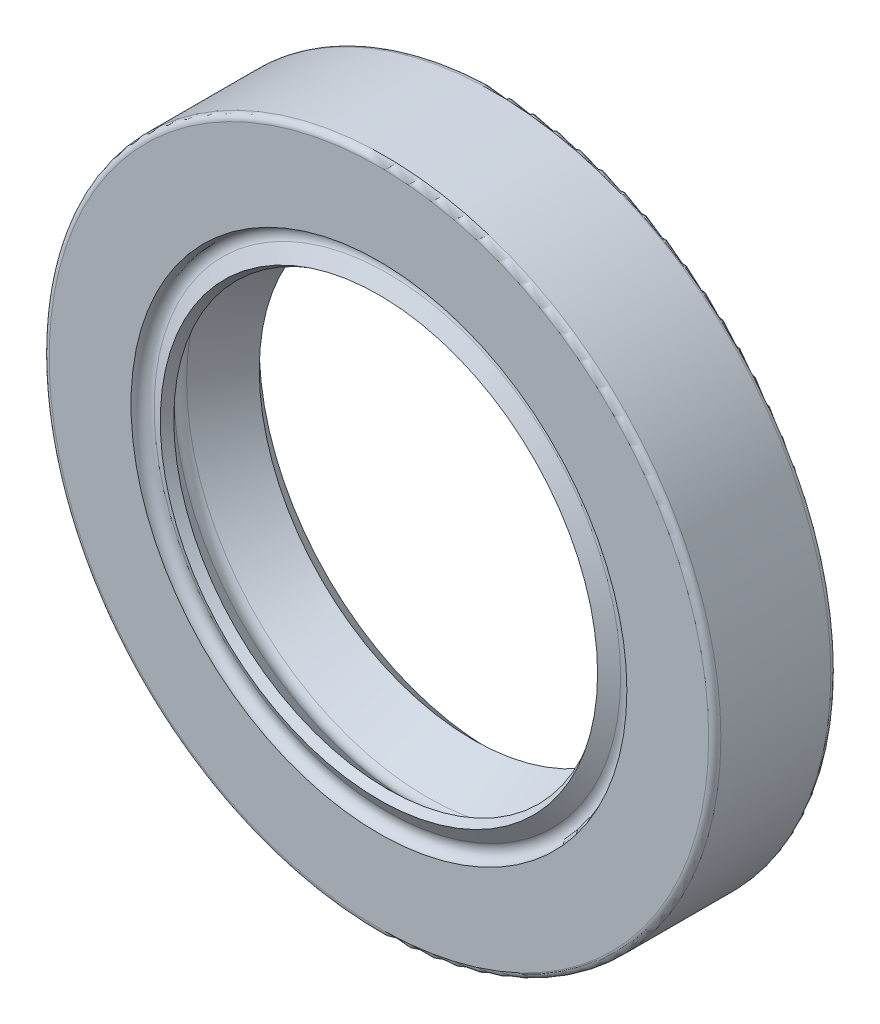
ISO-10303-21;
HEADER;
FILE_DESCRIPTION(('STEP AP214'),'2;1');
FILE_NAME('part.step','',(''),(''),'','','');
FILE_SCHEMA(('AUTOMOTIVE_DESIGN { 1 0 10303 214 1 1 1 1 }'));
ENDSEC;
DATA;
#1=APPLICATION_CONTEXT('core data for automotive mechanical design processes');
#2=APPLICATION_PROTOCOL_DEFINITION('international standard','automotive_design',2000,#1);
#3=PRODUCT_CONTEXT('',#1,'mechanical');
#4=PRODUCT('Part','Part','',(#3));
#5=PRODUCT_RELATED_PRODUCT_CATEGORY('part','',(#4));
#6=PRODUCT_DEFINITION_FORMATION('','',#4);
#7=PRODUCT_DEFINITION_CONTEXT('part definition',#1,'design');
#8=PRODUCT_DEFINITION('design','',#6,#7);
#9=PRODUCT_DEFINITION_SHAPE('','',#8);
#10=(LENGTH_UNIT() NAMED_UNIT(*) SI_UNIT(.MILLI.,.METRE.));
#11=(NAMED_UNIT(*) PLANE_ANGLE_UNIT() SI_UNIT($,.RADIAN.));
#12=(NAMED_UNIT(*) SI_UNIT($,.STERADIAN.) SOLID_ANGLE_UNIT());
#13=UNCERTAINTY_MEASURE_WITH_UNIT(LENGTH_MEASURE(1.E-05),#10,'distance_accuracy_value','');
#14=(GEOMETRIC_REPRESENTATION_CONTEXT(3) GLOBAL_UNCERTAINTY_ASSIGNED_CONTEXT((#13)) GLOBAL_UNIT_ASSIGNED_CONTEXT((#10,
#11,#12)) REPRESENTATION_CONTEXT('',''));
#15=CARTESIAN_POINT('',(0.,0.,0.));
#16=DIRECTION('',(0.,0.,1.));
#17=DIRECTION('',(1.,0.,0.));
#18=AXIS2_PLACEMENT_3D('',#15,#16,#17);
#19=CARTESIAN_POINT('',(0.,0.,-1.3));
#20=DIRECTION('',(0.,0.,1.));
#21=DIRECTION('',(1.,0.,0.));
#22=AXIS2_PLACEMENT_3D('',#19,#20,#21);
#23=TOROIDAL_SURFACE('',#22,9.58987520308393,0.2);
#24=CARTESIAN_POINT('',(0.,0.,-1.1));
#25=DIRECTION('',(0.,0.,1.));
#26=DIRECTION('',(1.,0.,0.));
#27=AXIS2_PLACEMENT_3D('',#24,#25,#26);
#28=CIRCLE('',#27,9.58987520308393);
#29=CARTESIAN_POINT('',(9.58987520308393,0.,-1.1));
#30=VERTEX_POINT('',#29);
#31=EDGE_CURVE('E10',#30,#30,#28,.T.);
#32=ORIENTED_EDGE('',*,*,#31,.T.);
#33=EDGE_LOOP('',(#32));
#34=FACE_BOUND('',#33,.T.);
#35=CARTESIAN_POINT('',(0.,0.,-1.28256885145047));
#36=DIRECTION('',(0.,0.,1.));
#37=DIRECTION('',(1.,0.,0.));
#38=AXIS2_PLACEMENT_3D('',#35,#36,#37);
#39=CIRCLE('',#38,9.78911414270228);
#40=CARTESIAN_POINT('',(9.78911414270228,0.,-1.28256885145047));
#41=VERTEX_POINT('',#40);
#42=EDGE_CURVE('E101',#41,#41,#39,.T.);
#43=ORIENTED_EDGE('',*,*,#42,.F.);
#44=EDGE_LOOP('',(#43));
#45=FACE_BOUND('',#44,.T.);
#46=ADVANCED_FACE('F34',(#34,#45),#23,.F.);
#47=CARTESIAN_POINT('',(9.58987520308393,0.,-1.1));
#48=DIRECTION('',(0.,0.,-1.));
#49=DIRECTION('',(-1.,0.,0.));
#50=AXIS2_PLACEMENT_3D('',#47,#48,#49);
#51=PLANE('',#50);
#52=CARTESIAN_POINT('',(0.,0.,-1.1));
#53=DIRECTION('',(0.,0.,1.));
#54=DIRECTION('',(1.,0.,0.));
#55=AXIS2_PLACEMENT_3D('',#52,#53,#54);
#56=CIRCLE('',#55,8.61010903491329);
#57=CARTESIAN_POINT('',(8.61010903491329,0.,-1.1));
#58=VERTEX_POINT('',#57);
#59=EDGE_CURVE('E40',#58,#58,#56,.T.);
#60=ORIENTED_EDGE('',*,*,#59,.T.);
#61=EDGE_LOOP('',(#60));
#62=FACE_BOUND('',#61,.T.);
#63=ORIENTED_EDGE('',*,*,#31,.F.);
#64=EDGE_LOOP('',(#63));
#65=FACE_BOUND('',#64,.T.);
#66=ADVANCED_FACE('F109',(#62,#65),#51,.T.);
#67=CARTESIAN_POINT('',(0.,0.,-1.3));
#68=DIRECTION('',(0.,0.,1.));
#69=DIRECTION('',(1.,0.,0.));
#70=AXIS2_PLACEMENT_3D('',#67,#68,#69);
#71=TOROIDAL_SURFACE('',#70,8.61010903491329,0.2);
#72=CARTESIAN_POINT('',(0.,0.,-1.28256885145048));
#73=DIRECTION('',(0.,0.,1.));
#74=DIRECTION('',(1.,0.,0.));
#75=AXIS2_PLACEMENT_3D('',#72,#73,#74);
#76=CIRCLE('',#75,8.41087009529494);
#77=CARTESIAN_POINT('',(8.41087009529494,0.,-1.28256885145048));
#78=VERTEX_POINT('',#77);
#79=EDGE_CURVE('E44',#78,#78,#76,.T.);
#80=ORIENTED_EDGE('',*,*,#79,.T.);
#81=EDGE_LOOP('',(#80));
#82=FACE_BOUND('',#81,.T.);
#83=ORIENTED_EDGE('',*,*,#59,.F.);
#84=EDGE_LOOP('',(#83));
#85=FACE_BOUND('',#84,.T.);
#86=ADVANCED_FACE('F113',(#82,#85),#71,.F.);
#87=CARTESIAN_POINT('',(0.,0.,-1.28256885145048));
#88=DIRECTION('',(0.,0.,1.));
#89=DIRECTION('',(1.,0.,0.));
#90=AXIS2_PLACEMENT_3D('',#87,#88,#89);
#91=CONICAL_SURFACE('',#90,8.41087009529494,0.0872664625996557);
#92=CARTESIAN_POINT('',(0.,0.,-2.44546455118659));
#93=DIRECTION('',(0.,0.,1.));
#94=DIRECTION('',(1.,0.,0.));
#95=AXIS2_PLACEMENT_3D('',#92,#93,#94);
#96=CIRCLE('',#95,8.30912990470506);
#97=CARTESIAN_POINT('',(8.30912990470506,0.,-2.44546455118659));
#98=VERTEX_POINT('',#97);
#99=EDGE_CURVE('E48',#98,#98,#96,.T.);
#100=ORIENTED_EDGE('',*,*,#99,.T.);
#101=EDGE_LOOP('',(#100));
#102=FACE_BOUND('',#101,.T.);
#103=ORIENTED_EDGE('',*,*,#79,.F.);
#104=EDGE_LOOP('',(#103));
#105=FACE_BOUND('',#104,.T.);
#106=ADVANCED_FACE('F117',(#102,#105),#91,.T.);
#107=CARTESIAN_POINT('',(0.,0.,-2.88));
#108=DIRECTION('',(0.,0.,1.));
#109=DIRECTION('',(1.,0.,0.));
#110=AXIS2_PLACEMENT_3D('',#107,#108,#109);
#111=TOROIDAL_SURFACE('',#110,8.24,0.44);
#112=CARTESIAN_POINT('',(0.,0.,-3.32));
#113=DIRECTION('',(0.,0.,1.));
#114=DIRECTION('',(1.,0.,0.));
#115=AXIS2_PLACEMENT_3D('',#112,#113,#114);
#116=CIRCLE('',#115,8.24);
#117=CARTESIAN_POINT('',(8.24,0.,-3.32));
#118=VERTEX_POINT('',#117);
#119=EDGE_CURVE('E53',#118,#118,#116,.T.);
#120=ORIENTED_EDGE('',*,*,#119,.T.);
#121=EDGE_LOOP('',(#120));
#122=FACE_BOUND('',#121,.T.);
#123=ORIENTED_EDGE('',*,*,#99,.F.);
#124=EDGE_LOOP('',(#123));
#125=FACE_BOUND('',#124,.T.);
#126=ADVANCED_FACE('F124',(#122,#125),#111,.F.);
#127=CARTESIAN_POINT('',(0.,0.,-3.52));
#128=DIRECTION('',(0.,0.,1.));
#129=DIRECTION('',(1.,0.,0.));
#130=AXIS2_PLACEMENT_3D('',#127,#128,#129);
#131=TOROIDAL_SURFACE('',#130,8.24,0.2);
#132=CARTESIAN_POINT('',(0.,0.,-3.72));
#133=DIRECTION('',(0.,0.,1.));
#134=DIRECTION('',(1.,0.,0.));
#135=AXIS2_PLACEMENT_3D('',#132,#133,#134);
#136=CIRCLE('',#135,8.24);
#137=CARTESIAN_POINT('',(8.24,0.,-3.72));
#138=VERTEX_POINT('',#137);
#139=EDGE_CURVE('E56',#138,#138,#136,.T.);
#140=ORIENTED_EDGE('',*,*,#139,.T.);
#141=EDGE_LOOP('',(#140));
#142=FACE_BOUND('',#141,.T.);
#143=ORIENTED_EDGE('',*,*,#119,.F.);
#144=EDGE_LOOP('',(#143));
#145=FACE_BOUND('',#144,.T.);
#146=ADVANCED_FACE('F128',(#142,#145),#131,.T.);
#147=CARTESIAN_POINT('',(7.64000000000003,0.,-3.72));
#148=DIRECTION('',(0.,0.,-1.));
#149=DIRECTION('',(-1.,0.,0.));
#150=AXIS2_PLACEMENT_3D('',#147,#148,#149);
#151=PLANE('',#150);
#152=CARTESIAN_POINT('',(0.,0.,-3.72));
#153=DIRECTION('',(0.,0.,1.));
#154=DIRECTION('',(1.,0.,0.));
#155=AXIS2_PLACEMENT_3D('',#152,#153,#154);
#156=CIRCLE('',#155,7.64000000000003);
#157=CARTESIAN_POINT('',(7.64000000000003,0.,-3.72));
#158=VERTEX_POINT('',#157);
#159=EDGE_CURVE('E59',#158,#158,#156,.T.);
#160=ORIENTED_EDGE('',*,*,#159,.T.);
#161=EDGE_LOOP('',(#160));
#162=FACE_BOUND('',#161,.T.);
#163=ORIENTED_EDGE('',*,*,#139,.F.);
#164=EDGE_LOOP('',(#163));
#165=FACE_BOUND('',#164,.T.);
#166=ADVANCED_FACE('F132',(#162,#165),#151,.T.);
#167=CARTESIAN_POINT('',(0.,0.,-3.72));
#168=DIRECTION('',(0.,0.,-1.));
#169=DIRECTION('',(-1.,0.,0.));
#170=AXIS2_PLACEMENT_3D('',#167,#168,#169);
#171=CONICAL_SURFACE('',#170,7.64000000000003,0.785398163397471);
#172=CARTESIAN_POINT('',(0.,0.,-3.08));
#173=DIRECTION('',(0.,0.,1.));
#174=DIRECTION('',(1.,0.,0.));
#175=AXIS2_PLACEMENT_3D('',#172,#173,#174);
#176=CIRCLE('',#175,7.);
#177=CARTESIAN_POINT('',(7.,0.,-3.08));
#178=VERTEX_POINT('',#177);
#179=EDGE_CURVE('E62',#178,#178,#176,.T.);
#180=ORIENTED_EDGE('',*,*,#179,.T.);
#181=EDGE_LOOP('',(#180));
#182=FACE_BOUND('',#181,.T.);
#183=ORIENTED_EDGE('',*,*,#159,.F.);
#184=EDGE_LOOP('',(#183));
#185=FACE_BOUND('',#184,.T.);
#186=ADVANCED_FACE('F136',(#182,#185),#171,.F.);
#187=CARTESIAN_POINT('',(0.,0.,-3.08));
#188=DIRECTION('',(0.,0.,1.));
#189=DIRECTION('',(1.,0.,0.));
#190=AXIS2_PLACEMENT_3D('',#187,#188,#189);
#191=CONICAL_SURFACE('',#190,7.,0.523598775598299);
#192=CARTESIAN_POINT('',(0.,0.,-1.57068099643608));
#193=DIRECTION('',(0.,0.,1.));
#194=DIRECTION('',(1.,0.,0.));
#195=AXIS2_PLACEMENT_3D('',#192,#193,#194);
#196=CIRCLE('',#195,7.87140573300065);
#197=CARTESIAN_POINT('',(7.87140573300065,0.,-1.57068099643608));
#198=VERTEX_POINT('',#197);
#199=EDGE_CURVE('E65',#198,#198,#196,.T.);
#200=ORIENTED_EDGE('',*,*,#199,.T.);
#201=EDGE_LOOP('',(#200));
#202=FACE_BOUND('',#201,.T.);
#203=ORIENTED_EDGE('',*,*,#179,.F.);
#204=EDGE_LOOP('',(#203));
#205=FACE_BOUND('',#204,.T.);
#206=ADVANCED_FACE('F140',(#202,#205),#191,.F.);
#207=CARTESIAN_POINT('',(0.,0.,-1.37068099643607));
#208=DIRECTION('',(0.,0.,1.));
#209=DIRECTION('',(1.,0.,0.));
#210=AXIS2_PLACEMENT_3D('',#207,#208,#209);
#211=TOROIDAL_SURFACE('',#210,7.52499557148687,0.400000000000001);
#212=CARTESIAN_POINT('',(0.,0.,-1.08783828396145));
#213=DIRECTION('',(0.,0.,1.));
#214=DIRECTION('',(1.,0.,0.));
#215=AXIS2_PLACEMENT_3D('',#212,#213,#214);
#216=CIRCLE('',#215,7.80783828396149);
#217=CARTESIAN_POINT('',(7.80783828396149,0.,-1.08783828396145));
#218=VERTEX_POINT('',#217);
#219=EDGE_CURVE('E68',#218,#218,#216,.T.);
#220=ORIENTED_EDGE('',*,*,#219,.T.);
#221=EDGE_LOOP('',(#220));
#222=FACE_BOUND('',#221,.T.);
#223=ORIENTED_EDGE('',*,*,#199,.F.);
#224=EDGE_LOOP('',(#223));
#225=FACE_BOUND('',#224,.T.);
#226=ADVANCED_FACE('F144',(#222,#225),#211,.F.);
#227=CARTESIAN_POINT('',(0.,0.,-1.08783828396145));
#228=DIRECTION('',(0.,0.,-1.));
#229=DIRECTION('',(-1.,0.,0.));
#230=AXIS2_PLACEMENT_3D('',#227,#228,#229);
#231=CONICAL_SURFACE('',#230,7.80783828396149,0.785398163397471);
#232=CARTESIAN_POINT('',(0.,0.,-0.279999999999999));
#233=DIRECTION('',(0.,0.,1.));
#234=DIRECTION('',(1.,0.,0.));
#235=AXIS2_PLACEMENT_3D('',#232,#233,#234);
#236=CIRCLE('',#235,7.);
#237=CARTESIAN_POINT('',(7.,0.,-0.279999999999999));
#238=VERTEX_POINT('',#237);
#239=EDGE_CURVE('E71',#238,#238,#236,.T.);
#240=ORIENTED_EDGE('',*,*,#239,.T.);
#241=EDGE_LOOP('',(#240));
#242=FACE_BOUND('',#241,.T.);
#243=ORIENTED_EDGE('',*,*,#219,.F.);
#244=EDGE_LOOP('',(#243));
#245=FACE_BOUND('',#244,.T.);
#246=ADVANCED_FACE('F148',(#242,#245),#231,.F.);
#247=CARTESIAN_POINT('',(0.,0.,-0.279999999999999));
#248=DIRECTION('',(0.,0.,1.));
#249=DIRECTION('',(1.,0.,0.));
#250=AXIS2_PLACEMENT_3D('',#247,#248,#249);
#251=CONICAL_SURFACE('',#250,7.,0.523598775598298);
#252=CARTESIAN_POINT('',(0.,0.,0.));
#253=DIRECTION('',(0.,0.,1.));
#254=DIRECTION('',(1.,0.,0.));
#255=AXIS2_PLACEMENT_3D('',#252,#253,#254);
#256=CIRCLE('',#255,7.16165807537309);
#257=CARTESIAN_POINT('',(7.16165807537309,0.,0.));
#258=VERTEX_POINT('',#257);
#259=EDGE_CURVE('E74',#258,#258,#256,.T.);
#260=ORIENTED_EDGE('',*,*,#259,.T.);
#261=EDGE_LOOP('',(#260));
#262=FACE_BOUND('',#261,.T.);
#263=ORIENTED_EDGE('',*,*,#239,.F.);
#264=EDGE_LOOP('',(#263));
#265=FACE_BOUND('',#264,.T.);
#266=ADVANCED_FACE('F152',(#262,#265),#251,.F.);
#267=CARTESIAN_POINT('',(0.,0.,0.));
#268=DIRECTION('',(0.,0.,-1.));
#269=DIRECTION('',(-1.,0.,0.));
#270=AXIS2_PLACEMENT_3D('',#267,#268,#269);
#271=CONICAL_SURFACE('',#270,7.16165807537309,1.04599853652755);
#272=CARTESIAN_POINT('',(0.,0.,-0.27693608770525));
#273=DIRECTION('',(0.,0.,1.));
#274=DIRECTION('',(1.,0.,0.));
#275=AXIS2_PLACEMENT_3D('',#272,#273,#274);
#276=CIRCLE('',#275,7.64000000000003);
#277=CARTESIAN_POINT('',(7.64000000000003,0.,-0.27693608770525));
#278=VERTEX_POINT('',#277);
#279=EDGE_CURVE('E77',#278,#278,#276,.T.);
#280=ORIENTED_EDGE('',*,*,#279,.T.);
#281=EDGE_LOOP('',(#280));
#282=FACE_BOUND('',#281,.T.);
#283=ORIENTED_EDGE('',*,*,#259,.F.);
#284=EDGE_LOOP('',(#283));
#285=FACE_BOUND('',#284,.T.);
#286=ADVANCED_FACE('F156',(#282,#285),#271,.T.);
#287=CARTESIAN_POINT('',(0.,0.,0.));
#288=DIRECTION('',(0.,0.,1.));
#289=DIRECTION('',(1.,0.,0.));
#290=AXIS2_PLACEMENT_3D('',#287,#288,#289);
#291=TOROIDAL_SURFACE('',#290,7.80033216560166,0.32);
#292=CARTESIAN_POINT('',(0.,0.,0.));
#293=DIRECTION('',(0.,0.,1.));
#294=DIRECTION('',(1.,0.,0.));
#295=AXIS2_PLACEMENT_3D('',#292,#293,#294);
#296=CIRCLE('',#295,8.12033216560166);
#297=CARTESIAN_POINT('',(8.12033216560166,0.,0.));
#298=VERTEX_POINT('',#297);
#299=EDGE_CURVE('E80',#298,#298,#296,.T.);
#300=ORIENTED_EDGE('',*,*,#299,.T.);
#301=EDGE_LOOP('',(#300));
#302=FACE_BOUND('',#301,.T.);
#303=ORIENTED_EDGE('',*,*,#279,.F.);
#304=EDGE_LOOP('',(#303));
#305=FACE_BOUND('',#304,.T.);
#306=ADVANCED_FACE('F160',(#302,#305),#291,.F.);
#307=CARTESIAN_POINT('',(10.8,0.,0.));
#308=DIRECTION('',(0.,0.,1.));
#309=DIRECTION('',(1.,0.,0.));
#310=AXIS2_PLACEMENT_3D('',#307,#308,#309);
#311=PLANE('',#310);
#312=CARTESIAN_POINT('',(0.,0.,0.));
#313=DIRECTION('',(0.,0.,1.));
#314=DIRECTION('',(1.,0.,0.));
#315=AXIS2_PLACEMENT_3D('',#312,#313,#314);
#316=CIRCLE('',#315,10.8);
#317=CARTESIAN_POINT('',(10.8,0.,0.));
#318=VERTEX_POINT('',#317);
#319=EDGE_CURVE('E83',#318,#318,#316,.T.);
#320=ORIENTED_EDGE('',*,*,#319,.T.);
#321=EDGE_LOOP('',(#320));
#322=FACE_BOUND('',#321,.T.);
#323=ORIENTED_EDGE('',*,*,#299,.F.);
#324=EDGE_LOOP('',(#323));
#325=FACE_BOUND('',#324,.T.);
#326=ADVANCED_FACE('F164',(#322,#325),#311,.T.);
#327=CARTESIAN_POINT('',(0.,0.,-0.2));
#328=DIRECTION('',(0.,0.,1.));
#329=DIRECTION('',(1.,0.,0.));
#330=AXIS2_PLACEMENT_3D('',#327,#328,#329);
#331=TOROIDAL_SURFACE('',#330,10.8,0.2);
#332=CARTESIAN_POINT('',(0.,0.,-0.2));
#333=DIRECTION('',(0.,0.,1.));
#334=DIRECTION('',(1.,0.,0.));
#335=AXIS2_PLACEMENT_3D('',#332,#333,#334);
#336=CIRCLE('',#335,11.);
#337=CARTESIAN_POINT('',(11.,0.,-0.2));
#338=VERTEX_POINT('',#337);
#339=EDGE_CURVE('E86',#338,#338,#336,.T.);
#340=ORIENTED_EDGE('',*,*,#339,.T.);
#341=EDGE_LOOP('',(#340));
#342=FACE_BOUND('',#341,.T.);
#343=ORIENTED_EDGE('',*,*,#319,.F.);
#344=EDGE_LOOP('',(#343));
#345=FACE_BOUND('',#344,.T.);
#346=ADVANCED_FACE('F168',(#342,#345),#331,.T.);
#347=CARTESIAN_POINT('',(0.,0.,0.));
#348=DIRECTION('',(0.,0.,1.));
#349=DIRECTION('',(1.,0.,0.));
#350=AXIS2_PLACEMENT_3D('',#347,#348,#349);
#351=CYLINDRICAL_SURFACE('',#350,11.);
#352=CARTESIAN_POINT('',(0.,0.,-3.8));
#353=DIRECTION('',(0.,0.,1.));
#354=DIRECTION('',(1.,0.,0.));
#355=AXIS2_PLACEMENT_3D('',#352,#353,#354);
#356=CIRCLE('',#355,11.);
#357=CARTESIAN_POINT('',(11.,0.,-3.8));
#358=VERTEX_POINT('',#357);
#359=EDGE_CURVE('E89',#358,#358,#356,.T.);
#360=ORIENTED_EDGE('',*,*,#359,.T.);
#361=EDGE_LOOP('',(#360));
#362=FACE_BOUND('',#361,.T.);
#363=ORIENTED_EDGE('',*,*,#339,.F.);
#364=EDGE_LOOP('',(#363));
#365=FACE_BOUND('',#364,.T.);
#366=ADVANCED_FACE('F172',(#362,#365),#351,.T.);
#367=CARTESIAN_POINT('',(0.,0.,-3.8));
#368=DIRECTION('',(0.,0.,1.));
#369=DIRECTION('',(1.,0.,0.));
#370=AXIS2_PLACEMENT_3D('',#367,#368,#369);
#371=TOROIDAL_SURFACE('',#370,10.8,0.200000000000001);
#372=CARTESIAN_POINT('',(0.,0.,-4.));
#373=DIRECTION('',(0.,0.,1.));
#374=DIRECTION('',(1.,0.,0.));
#375=AXIS2_PLACEMENT_3D('',#372,#373,#374);
#376=CIRCLE('',#375,10.8);
#377=CARTESIAN_POINT('',(10.8,0.,-4.));
#378=VERTEX_POINT('',#377);
#379=EDGE_CURVE('E92',#378,#378,#376,.T.);
#380=ORIENTED_EDGE('',*,*,#379,.T.);
#381=EDGE_LOOP('',(#380));
#382=FACE_BOUND('',#381,.T.);
#383=ORIENTED_EDGE('',*,*,#359,.F.);
#384=EDGE_LOOP('',(#383));
#385=FACE_BOUND('',#384,.T.);
#386=ADVANCED_FACE('F176',(#382,#385),#371,.T.);
#387=CARTESIAN_POINT('',(10.8,0.,-4.));
#388=DIRECTION('',(0.,0.,-1.));
#389=DIRECTION('',(-1.,0.,0.));
#390=AXIS2_PLACEMENT_3D('',#387,#388,#389);
#391=PLANE('',#390);
#392=CARTESIAN_POINT('',(0.,0.,-4.));
#393=DIRECTION('',(0.,0.,1.));
#394=DIRECTION('',(1.,0.,0.));
#395=AXIS2_PLACEMENT_3D('',#392,#393,#394);
#396=CIRCLE('',#395,10.2101247969161);
#397=CARTESIAN_POINT('',(10.2101247969161,0.,-4.));
#398=VERTEX_POINT('',#397);
#399=EDGE_CURVE('E95',#398,#398,#396,.T.);
#400=ORIENTED_EDGE('',*,*,#399,.T.);
#401=EDGE_LOOP('',(#400));
#402=FACE_BOUND('',#401,.T.);
#403=ORIENTED_EDGE('',*,*,#379,.F.);
#404=EDGE_LOOP('',(#403));
#405=FACE_BOUND('',#404,.T.);
#406=ADVANCED_FACE('F180',(#402,#405),#391,.T.);
#407=CARTESIAN_POINT('',(0.,0.,-3.8));
#408=DIRECTION('',(0.,0.,1.));
#409=DIRECTION('',(1.,0.,0.));
#410=AXIS2_PLACEMENT_3D('',#407,#408,#409);
#411=TOROIDAL_SURFACE('',#410,10.2101247969161,0.2);
#412=CARTESIAN_POINT('',(0.,0.,-3.81743114854953));
#413=DIRECTION('',(0.,0.,1.));
#414=DIRECTION('',(1.,0.,0.));
#415=AXIS2_PLACEMENT_3D('',#412,#413,#414);
#416=CIRCLE('',#415,10.0108858572977);
#417=CARTESIAN_POINT('',(10.0108858572977,0.,-3.81743114854953));
#418=VERTEX_POINT('',#417);
#419=EDGE_CURVE('E98',#418,#418,#416,.T.);
#420=ORIENTED_EDGE('',*,*,#419,.T.);
#421=EDGE_LOOP('',(#420));
#422=FACE_BOUND('',#421,.T.);
#423=ORIENTED_EDGE('',*,*,#399,.F.);
#424=EDGE_LOOP('',(#423));
#425=FACE_BOUND('',#424,.T.);
#426=ADVANCED_FACE('F184',(#422,#425),#411,.T.);
#427=CARTESIAN_POINT('',(0.,0.,-3.81743114854953));
#428=DIRECTION('',(0.,0.,-1.));
#429=DIRECTION('',(-1.,0.,0.));
#430=AXIS2_PLACEMENT_3D('',#427,#428,#429);
#431=CONICAL_SURFACE('',#430,10.0108858572977,0.0872664625997127);
#432=ORIENTED_EDGE('',*,*,#42,.T.);
#433=EDGE_LOOP('',(#432));
#434=FACE_BOUND('',#433,.T.);
#435=ORIENTED_EDGE('',*,*,#419,.F.);
#436=EDGE_LOOP('',(#435));
#437=FACE_BOUND('',#436,.T.);
#438=ADVANCED_FACE('F105',(#434,#437),#431,.F.);
#439=CLOSED_SHELL('',(#46,#66,#86,#106,#126,#146,#166,#186,#206,#226,#246,#266,#286,#306,#326,
#346,#366,#386,#406,#426,#438));
#440=MANIFOLD_SOLID_BREP('B2',#439);
#441=ADVANCED_BREP_SHAPE_REPRESENTATION('',(#18,#440),#14);
#442=SHAPE_DEFINITION_REPRESENTATION(#9,#441);
ENDSEC;
END-ISO-10303-21;
